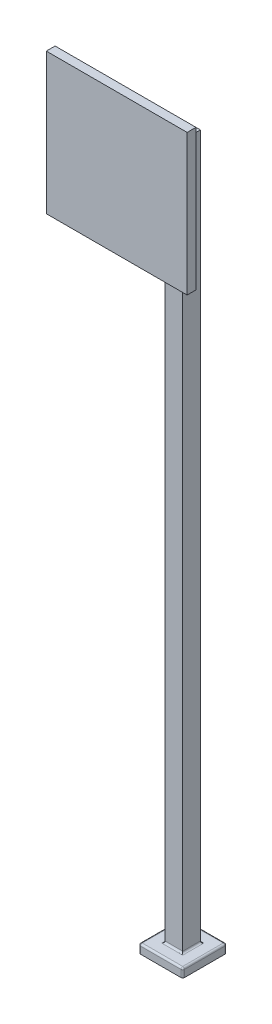
ISO-10303-21;
HEADER;
FILE_DESCRIPTION(('STEP AP214'),'2;1');
FILE_NAME('part.step','',(''),(''),'','','');
FILE_SCHEMA(('AUTOMOTIVE_DESIGN { 1 0 10303 214 1 1 1 1 }'));
ENDSEC;
DATA;
#1=APPLICATION_CONTEXT('core data for automotive mechanical design processes');
#2=APPLICATION_PROTOCOL_DEFINITION('international standard','automotive_design',2000,#1);
#3=PRODUCT_CONTEXT('',#1,'mechanical');
#4=PRODUCT('Part','Part','',(#3));
#5=PRODUCT_RELATED_PRODUCT_CATEGORY('part','',(#4));
#6=PRODUCT_DEFINITION_FORMATION('','',#4);
#7=PRODUCT_DEFINITION_CONTEXT('part definition',#1,'design');
#8=PRODUCT_DEFINITION('design','',#6,#7);
#9=PRODUCT_DEFINITION_SHAPE('','',#8);
#10=(LENGTH_UNIT() NAMED_UNIT(*) SI_UNIT(.MILLI.,.METRE.));
#11=(NAMED_UNIT(*) PLANE_ANGLE_UNIT() SI_UNIT($,.RADIAN.));
#12=(NAMED_UNIT(*) SI_UNIT($,.STERADIAN.) SOLID_ANGLE_UNIT());
#13=UNCERTAINTY_MEASURE_WITH_UNIT(LENGTH_MEASURE(1.E-05),#10,'distance_accuracy_value','');
#14=(GEOMETRIC_REPRESENTATION_CONTEXT(3) GLOBAL_UNCERTAINTY_ASSIGNED_CONTEXT((#13)) GLOBAL_UNIT_ASSIGNED_CONTEXT((#10,
#11,#12)) REPRESENTATION_CONTEXT('',''));
#15=CARTESIAN_POINT('',(0.,0.,0.));
#16=DIRECTION('',(0.,0.,1.));
#17=DIRECTION('',(1.,0.,0.));
#18=AXIS2_PLACEMENT_3D('',#15,#16,#17);
#19=CARTESIAN_POINT('',(-50.0000000000005,4000.,50.));
#20=DIRECTION('',(0.,-1.,0.));
#21=DIRECTION('',(0.,0.,-1.));
#22=AXIS2_PLACEMENT_3D('',#19,#20,#21);
#23=PLANE('',#22);
#24=DIRECTION('',(0.,0.,1.));
#25=VECTOR('',#24,1.);
#26=CARTESIAN_POINT('',(-25.,4000.,-50.));
#27=LINE('',#26,#25);
#28=CARTESIAN_POINT('',(-25.,4000.,60.));
#29=VERTEX_POINT('',#28);
#30=CARTESIAN_POINT('',(-25.,4000.,315.));
#31=VERTEX_POINT('',#30);
#32=EDGE_CURVE('E273',#29,#31,#27,.T.);
#33=ORIENTED_EDGE('',*,*,#32,.T.);
#34=DIRECTION('',(-1.,0.,0.));
#35=VECTOR('',#34,1.);
#36=CARTESIAN_POINT('',(35.,4000.,315.));
#37=LINE('',#36,#35);
#38=CARTESIAN_POINT('',(25.,4000.,315.));
#39=VERTEX_POINT('',#38);
#40=EDGE_CURVE('E529',#31,#39,#37,.F.);
#41=ORIENTED_EDGE('',*,*,#40,.T.);
#42=DIRECTION('',(0.,0.,1.));
#43=VECTOR('',#42,1.);
#44=CARTESIAN_POINT('',(25.,4000.,-50.));
#45=LINE('',#44,#43);
#46=CARTESIAN_POINT('',(25.,4000.,60.));
#47=VERTEX_POINT('',#46);
#48=EDGE_CURVE('E260',#47,#39,#45,.T.);
#49=ORIENTED_EDGE('',*,*,#48,.F.);
#50=CARTESIAN_POINT('',(35.,4000.,60.));
#51=DIRECTION('',(0.,-1.,0.));
#52=DIRECTION('',(0.,0.,-1.));
#53=AXIS2_PLACEMENT_3D('',#50,#51,#52);
#54=CIRCLE('',#53,10.);
#55=CARTESIAN_POINT('',(35.,4000.,50.));
#56=VERTEX_POINT('',#55);
#57=EDGE_CURVE('E516',#47,#56,#54,.T.);
#58=ORIENTED_EDGE('',*,*,#57,.T.);
#59=DIRECTION('',(-1.,0.,0.));
#60=VECTOR('',#59,1.);
#61=CARTESIAN_POINT('',(-50.0000000000005,4000.,50.));
#62=LINE('',#61,#60);
#63=CARTESIAN_POINT('',(49.999999999999,4000.,50.));
#64=VERTEX_POINT('',#63);
#65=EDGE_CURVE('E313',#64,#56,#62,.T.);
#66=ORIENTED_EDGE('',*,*,#65,.F.);
#67=DIRECTION('',(0.,0.,-1.));
#68=VECTOR('',#67,1.);
#69=CARTESIAN_POINT('',(49.999999999999,4000.,50.));
#70=LINE('',#69,#68);
#71=CARTESIAN_POINT('',(49.999999999999,4000.,-50.));
#72=VERTEX_POINT('',#71);
#73=EDGE_CURVE('E329',#64,#72,#70,.T.);
#74=ORIENTED_EDGE('',*,*,#73,.T.);
#75=DIRECTION('',(-1.,0.,0.));
#76=VECTOR('',#75,1.);
#77=CARTESIAN_POINT('',(-50.0000000000005,4000.,-50.));
#78=LINE('',#77,#76);
#79=CARTESIAN_POINT('',(-50.0000000000005,4000.,-50.));
#80=VERTEX_POINT('',#79);
#81=EDGE_CURVE('E309',#72,#80,#78,.T.);
#82=ORIENTED_EDGE('',*,*,#81,.T.);
#83=DIRECTION('',(0.,0.,-1.));
#84=VECTOR('',#83,1.);
#85=CARTESIAN_POINT('',(-50.0000000000005,4000.,50.));
#86=LINE('',#85,#84);
#87=CARTESIAN_POINT('',(-50.0000000000005,4000.,50.));
#88=VERTEX_POINT('',#87);
#89=EDGE_CURVE('E317',#88,#80,#86,.T.);
#90=ORIENTED_EDGE('',*,*,#89,.F.);
#91=CARTESIAN_POINT('',(-35.,4000.,50.));
#92=VERTEX_POINT('',#91);
#93=EDGE_CURVE('E312',#92,#88,#62,.T.);
#94=ORIENTED_EDGE('',*,*,#93,.F.);
#95=CARTESIAN_POINT('',(-35.,4000.,60.));
#96=DIRECTION('',(0.,-1.,0.));
#97=DIRECTION('',(0.,0.,-1.));
#98=AXIS2_PLACEMENT_3D('',#95,#96,#97);
#99=CIRCLE('',#98,10.);
#100=EDGE_CURVE('E510',#92,#29,#99,.T.);
#101=ORIENTED_EDGE('',*,*,#100,.T.);
#102=EDGE_LOOP('',(#33,#41,#49,#58,#66,#74,#82,#90,#94,#101));
#103=FACE_BOUND('',#102,.T.);
#104=ADVANCED_FACE('F47',(#103),#23,.F.);
#105=CARTESIAN_POINT('',(-25.,3950.,-50.));
#106=DIRECTION('',(0.,-1.,0.));
#107=DIRECTION('',(0.,0.,-1.));
#108=AXIS2_PLACEMENT_3D('',#105,#106,#107);
#109=PLANE('',#108);
#110=DIRECTION('',(0.,0.,-1.));
#111=VECTOR('',#110,1.);
#112=CARTESIAN_POINT('',(25.,3950.,-50.));
#113=LINE('',#112,#111);
#114=CARTESIAN_POINT('',(25.,3950.,315.));
#115=VERTEX_POINT('',#114);
#116=CARTESIAN_POINT('',(25.,3950.,60.));
#117=VERTEX_POINT('',#116);
#118=EDGE_CURVE('E266',#115,#117,#113,.T.);
#119=ORIENTED_EDGE('',*,*,#118,.F.);
#120=DIRECTION('',(-1.,0.,0.));
#121=VECTOR('',#120,1.);
#122=CARTESIAN_POINT('',(-25.,3950.,315.));
#123=LINE('',#122,#121);
#124=CARTESIAN_POINT('',(-25.,3950.,315.));
#125=VERTEX_POINT('',#124);
#126=EDGE_CURVE('E519',#115,#125,#123,.T.);
#127=ORIENTED_EDGE('',*,*,#126,.T.);
#128=DIRECTION('',(0.,0.,-1.));
#129=VECTOR('',#128,1.);
#130=CARTESIAN_POINT('',(-25.,3950.,-50.));
#131=LINE('',#130,#129);
#132=CARTESIAN_POINT('',(-25.,3950.,60.));
#133=VERTEX_POINT('',#132);
#134=EDGE_CURVE('E277',#125,#133,#131,.T.);
#135=ORIENTED_EDGE('',*,*,#134,.T.);
#136=CARTESIAN_POINT('',(-35.,3950.,60.));
#137=DIRECTION('',(0.,-1.,0.));
#138=DIRECTION('',(0.,0.,-1.));
#139=AXIS2_PLACEMENT_3D('',#136,#137,#138);
#140=CIRCLE('',#139,10.);
#141=CARTESIAN_POINT('',(-35.,3950.,50.));
#142=VERTEX_POINT('',#141);
#143=EDGE_CURVE('E506',#133,#142,#140,.F.);
#144=ORIENTED_EDGE('',*,*,#143,.T.);
#145=DIRECTION('',(1.,0.,0.));
#146=VECTOR('',#145,1.);
#147=CARTESIAN_POINT('',(0.,3950.,50.));
#148=LINE('',#147,#146);
#149=CARTESIAN_POINT('',(35.,3950.,50.));
#150=VERTEX_POINT('',#149);
#151=EDGE_CURVE('E280',#142,#150,#148,.T.);
#152=ORIENTED_EDGE('',*,*,#151,.T.);
#153=CARTESIAN_POINT('',(35.,3950.,60.));
#154=DIRECTION('',(0.,-1.,0.));
#155=DIRECTION('',(0.,0.,-1.));
#156=AXIS2_PLACEMENT_3D('',#153,#154,#155);
#157=CIRCLE('',#156,10.);
#158=EDGE_CURVE('E513',#150,#117,#157,.F.);
#159=ORIENTED_EDGE('',*,*,#158,.T.);
#160=EDGE_LOOP('',(#119,#127,#135,#144,#152,#159));
#161=FACE_BOUND('',#160,.T.);
#162=ADVANCED_FACE('F564',(#161),#109,.T.);
#163=CARTESIAN_POINT('',(-25.,0.,0.));
#164=DIRECTION('',(-1.,0.,0.));
#165=DIRECTION('',(0.,0.,1.));
#166=AXIS2_PLACEMENT_3D('',#163,#164,#165);
#167=PLANE('',#166);
#168=ORIENTED_EDGE('',*,*,#32,.F.);
#169=DIRECTION('',(0.,-1.,0.));
#170=VECTOR('',#169,1.);
#171=CARTESIAN_POINT('',(-25.,3950.,60.));
#172=LINE('',#171,#170);
#173=EDGE_CURVE('E484',#29,#133,#172,.T.);
#174=ORIENTED_EDGE('',*,*,#173,.T.);
#175=ORIENTED_EDGE('',*,*,#134,.F.);
#176=DIRECTION('',(0.,1.,0.));
#177=VECTOR('',#176,1.);
#178=CARTESIAN_POINT('',(-25.,0.,315.));
#179=LINE('',#178,#177);
#180=EDGE_CURVE('E420',#125,#31,#179,.T.);
#181=ORIENTED_EDGE('',*,*,#180,.T.);
#182=EDGE_LOOP('',(#168,#174,#175,#181));
#183=FACE_BOUND('',#182,.T.);
#184=ADVANCED_FACE('F548',(#183),#167,.T.);
#185=CARTESIAN_POINT('',(25.,0.,0.));
#186=DIRECTION('',(-1.,0.,0.));
#187=DIRECTION('',(0.,0.,1.));
#188=AXIS2_PLACEMENT_3D('',#185,#186,#187);
#189=PLANE('',#188);
#190=ORIENTED_EDGE('',*,*,#48,.T.);
#191=DIRECTION('',(0.,1.,0.));
#192=VECTOR('',#191,1.);
#193=CARTESIAN_POINT('',(25.,3950.,315.));
#194=LINE('',#193,#192);
#195=EDGE_CURVE('E502',#39,#115,#194,.F.);
#196=ORIENTED_EDGE('',*,*,#195,.T.);
#197=ORIENTED_EDGE('',*,*,#118,.T.);
#198=DIRECTION('',(0.,-1.,0.));
#199=VECTOR('',#198,1.);
#200=CARTESIAN_POINT('',(25.,0.,60.));
#201=LINE('',#200,#199);
#202=EDGE_CURVE('E499',#117,#47,#201,.F.);
#203=ORIENTED_EDGE('',*,*,#202,.T.);
#204=EDGE_LOOP('',(#190,#196,#197,#203));
#205=FACE_BOUND('',#204,.T.);
#206=ADVANCED_FACE('F560',(#205),#189,.F.);
#207=CARTESIAN_POINT('',(-50.0000000000005,4000.,50.));
#208=DIRECTION('',(1.,0.,0.));
#209=DIRECTION('',(0.,1.,0.));
#210=AXIS2_PLACEMENT_3D('',#207,#208,#209);
#211=PLANE('',#210);
#212=DIRECTION('',(0.,-1.,0.));
#213=VECTOR('',#212,1.);
#214=CARTESIAN_POINT('',(-50.0000000000005,4000.,-50.));
#215=LINE('',#214,#213);
#216=CARTESIAN_POINT('',(-50.,9.99999999999979,-50.));
#217=VERTEX_POINT('',#216);
#218=EDGE_CURVE('E303',#80,#217,#215,.T.);
#219=ORIENTED_EDGE('',*,*,#218,.T.);
#220=DIRECTION('',(0.,0.,-1.));
#221=VECTOR('',#220,1.);
#222=CARTESIAN_POINT('',(-50.,9.99999999999979,50.));
#223=LINE('',#222,#221);
#224=CARTESIAN_POINT('',(-50.,9.99999999999979,50.));
#225=VERTEX_POINT('',#224);
#226=EDGE_CURVE('E414',#217,#225,#223,.F.);
#227=ORIENTED_EDGE('',*,*,#226,.T.);
#228=DIRECTION('',(0.,-1.,0.));
#229=VECTOR('',#228,1.);
#230=CARTESIAN_POINT('',(-50.0000000000005,4000.,50.));
#231=LINE('',#230,#229);
#232=EDGE_CURVE('E304',#88,#225,#231,.T.);
#233=ORIENTED_EDGE('',*,*,#232,.F.);
#234=ORIENTED_EDGE('',*,*,#89,.T.);
#235=EDGE_LOOP('',(#219,#227,#233,#234));
#236=FACE_BOUND('',#235,.T.);
#237=ADVANCED_FACE('F622',(#236),#211,.F.);
#238=CARTESIAN_POINT('',(49.999999999999,4000.,50.));
#239=DIRECTION('',(-1.,0.,0.));
#240=DIRECTION('',(0.,-1.,0.));
#241=AXIS2_PLACEMENT_3D('',#238,#239,#240);
#242=PLANE('',#241);
#243=DIRECTION('',(0.,1.,0.));
#244=VECTOR('',#243,1.);
#245=CARTESIAN_POINT('',(49.999999999999,4000.,50.));
#246=LINE('',#245,#244);
#247=CARTESIAN_POINT('',(50.,9.99999999999979,50.));
#248=VERTEX_POINT('',#247);
#249=EDGE_CURVE('E308',#248,#64,#246,.T.);
#250=ORIENTED_EDGE('',*,*,#249,.F.);
#251=DIRECTION('',(0.,0.,-1.));
#252=VECTOR('',#251,1.);
#253=CARTESIAN_POINT('',(50.,9.99999999999979,50.));
#254=LINE('',#253,#252);
#255=CARTESIAN_POINT('',(50.,9.99999999999979,-50.));
#256=VERTEX_POINT('',#255);
#257=EDGE_CURVE('E417',#248,#256,#254,.T.);
#258=ORIENTED_EDGE('',*,*,#257,.T.);
#259=DIRECTION('',(0.,1.,0.));
#260=VECTOR('',#259,1.);
#261=CARTESIAN_POINT('',(49.999999999999,4000.,-50.));
#262=LINE('',#261,#260);
#263=EDGE_CURVE('E321',#256,#72,#262,.T.);
#264=ORIENTED_EDGE('',*,*,#263,.T.);
#265=ORIENTED_EDGE('',*,*,#73,.F.);
#266=EDGE_LOOP('',(#250,#258,#264,#265));
#267=FACE_BOUND('',#266,.T.);
#268=ADVANCED_FACE('F618',(#267),#242,.F.);
#269=CARTESIAN_POINT('',(0.,0.,50.));
#270=DIRECTION('',(0.,0.,1.));
#271=DIRECTION('',(1.,0.,0.));
#272=AXIS2_PLACEMENT_3D('',#269,#270,#271);
#273=PLANE('',#272);
#274=ORIENTED_EDGE('',*,*,#151,.F.);
#275=DIRECTION('',(0.,-1.,0.));
#276=VECTOR('',#275,1.);
#277=CARTESIAN_POINT('',(-35.,4000.,50.));
#278=LINE('',#277,#276);
#279=EDGE_CURVE('E492',#142,#92,#278,.F.);
#280=ORIENTED_EDGE('',*,*,#279,.T.);
#281=ORIENTED_EDGE('',*,*,#93,.T.);
#282=ORIENTED_EDGE('',*,*,#232,.T.);
#283=DIRECTION('',(1.,0.,0.));
#284=VECTOR('',#283,1.);
#285=CARTESIAN_POINT('',(50.,10.,50.));
#286=LINE('',#285,#284);
#287=EDGE_CURVE('E381',#225,#248,#286,.T.);
#288=ORIENTED_EDGE('',*,*,#287,.T.);
#289=ORIENTED_EDGE('',*,*,#249,.T.);
#290=ORIENTED_EDGE('',*,*,#65,.T.);
#291=DIRECTION('',(0.,-1.,0.));
#292=VECTOR('',#291,1.);
#293=CARTESIAN_POINT('',(35.,0.,50.));
#294=LINE('',#293,#292);
#295=EDGE_CURVE('E488',#56,#150,#294,.T.);
#296=ORIENTED_EDGE('',*,*,#295,.T.);
#297=EDGE_LOOP('',(#274,#280,#281,#282,#288,#289,#290,#296));
#298=FACE_BOUND('',#297,.T.);
#299=ADVANCED_FACE('F621',(#298),#273,.T.);
#300=CARTESIAN_POINT('',(0.,0.,-50.));
#301=DIRECTION('',(0.,0.,1.));
#302=DIRECTION('',(1.,0.,0.));
#303=AXIS2_PLACEMENT_3D('',#300,#301,#302);
#304=PLANE('',#303);
#305=ORIENTED_EDGE('',*,*,#263,.F.);
#306=DIRECTION('',(1.,0.,0.));
#307=VECTOR('',#306,1.);
#308=CARTESIAN_POINT('',(0.,10.,-50.));
#309=LINE('',#308,#307);
#310=EDGE_CURVE('E411',#256,#217,#309,.F.);
#311=ORIENTED_EDGE('',*,*,#310,.T.);
#312=ORIENTED_EDGE('',*,*,#218,.F.);
#313=ORIENTED_EDGE('',*,*,#81,.F.);
#314=EDGE_LOOP('',(#305,#311,#312,#313));
#315=FACE_BOUND('',#314,.T.);
#316=ADVANCED_FACE('F616',(#315),#304,.F.);
#317=CARTESIAN_POINT('',(125.,-50.,-125.));
#318=DIRECTION('',(1.,0.,0.));
#319=DIRECTION('',(0.,0.,-1.));
#320=AXIS2_PLACEMENT_3D('',#317,#318,#319);
#321=PLANE('',#320);
#322=DIRECTION('',(0.,0.,-1.));
#323=VECTOR('',#322,1.);
#324=CARTESIAN_POINT('',(125.,-10.,-125.));
#325=LINE('',#324,#323);
#326=CARTESIAN_POINT('',(125.,-10.,-115.));
#327=VERTEX_POINT('',#326);
#328=CARTESIAN_POINT('',(125.,-10.,115.));
#329=VERTEX_POINT('',#328);
#330=EDGE_CURVE('E342',#327,#329,#325,.F.);
#331=ORIENTED_EDGE('',*,*,#330,.T.);
#332=DIRECTION('',(0.,1.,0.));
#333=VECTOR('',#332,1.);
#334=CARTESIAN_POINT('',(125.,-50.,115.));
#335=LINE('',#334,#333);
#336=CARTESIAN_POINT('',(125.,-50.,115.));
#337=VERTEX_POINT('',#336);
#338=EDGE_CURVE('E348',#329,#337,#335,.F.);
#339=ORIENTED_EDGE('',*,*,#338,.T.);
#340=DIRECTION('',(0.,0.,-1.));
#341=VECTOR('',#340,1.);
#342=CARTESIAN_POINT('',(125.,-50.,-125.));
#343=LINE('',#342,#341);
#344=CARTESIAN_POINT('',(125.,-50.,-115.));
#345=VERTEX_POINT('',#344);
#346=EDGE_CURVE('E287',#337,#345,#343,.T.);
#347=ORIENTED_EDGE('',*,*,#346,.T.);
#348=DIRECTION('',(0.,1.,0.));
#349=VECTOR('',#348,1.);
#350=CARTESIAN_POINT('',(125.,-50.,-115.));
#351=LINE('',#350,#349);
#352=EDGE_CURVE('E345',#345,#327,#351,.T.);
#353=ORIENTED_EDGE('',*,*,#352,.T.);
#354=EDGE_LOOP('',(#331,#339,#347,#353));
#355=FACE_BOUND('',#354,.T.);
#356=ADVANCED_FACE('F941',(#355),#321,.T.);
#357=CARTESIAN_POINT('',(-125.,-50.,125.));
#358=DIRECTION('',(0.,0.,1.));
#359=DIRECTION('',(1.,0.,0.));
#360=AXIS2_PLACEMENT_3D('',#357,#358,#359);
#361=PLANE('',#360);
#362=DIRECTION('',(1.,0.,0.));
#363=VECTOR('',#362,1.);
#364=CARTESIAN_POINT('',(-125.,-50.,125.));
#365=LINE('',#364,#363);
#366=CARTESIAN_POINT('',(-115.,-50.,125.));
#367=VERTEX_POINT('',#366);
#368=CARTESIAN_POINT('',(115.,-50.,125.));
#369=VERTEX_POINT('',#368);
#370=EDGE_CURVE('E299',#367,#369,#365,.T.);
#371=ORIENTED_EDGE('',*,*,#370,.T.);
#372=DIRECTION('',(0.,1.,0.));
#373=VECTOR('',#372,1.);
#374=CARTESIAN_POINT('',(115.,-50.,125.));
#375=LINE('',#374,#373);
#376=CARTESIAN_POINT('',(115.,-10.,125.));
#377=VERTEX_POINT('',#376);
#378=EDGE_CURVE('E339',#369,#377,#375,.T.);
#379=ORIENTED_EDGE('',*,*,#378,.T.);
#380=DIRECTION('',(1.,0.,0.));
#381=VECTOR('',#380,1.);
#382=CARTESIAN_POINT('',(-125.,-10.,125.));
#383=LINE('',#382,#381);
#384=CARTESIAN_POINT('',(-115.,-10.,125.));
#385=VERTEX_POINT('',#384);
#386=EDGE_CURVE('E333',#377,#385,#383,.F.);
#387=ORIENTED_EDGE('',*,*,#386,.T.);
#388=DIRECTION('',(0.,1.,0.));
#389=VECTOR('',#388,1.);
#390=CARTESIAN_POINT('',(-115.,-50.,125.));
#391=LINE('',#390,#389);
#392=EDGE_CURVE('E336',#385,#367,#391,.F.);
#393=ORIENTED_EDGE('',*,*,#392,.T.);
#394=EDGE_LOOP('',(#371,#379,#387,#393));
#395=FACE_BOUND('',#394,.T.);
#396=ADVANCED_FACE('F929',(#395),#361,.T.);
#397=CARTESIAN_POINT('',(-125.,-50.,-125.));
#398=DIRECTION('',(-1.,0.,0.));
#399=DIRECTION('',(0.,0.,1.));
#400=AXIS2_PLACEMENT_3D('',#397,#398,#399);
#401=PLANE('',#400);
#402=DIRECTION('',(0.,0.,1.));
#403=VECTOR('',#402,1.);
#404=CARTESIAN_POINT('',(-125.,-50.,-125.));
#405=LINE('',#404,#403);
#406=CARTESIAN_POINT('',(-125.,-50.,-115.));
#407=VERTEX_POINT('',#406);
#408=CARTESIAN_POINT('',(-125.,-50.,115.));
#409=VERTEX_POINT('',#408);
#410=EDGE_CURVE('E295',#407,#409,#405,.T.);
#411=ORIENTED_EDGE('',*,*,#410,.T.);
#412=DIRECTION('',(0.,1.,0.));
#413=VECTOR('',#412,1.);
#414=CARTESIAN_POINT('',(-125.,-50.,115.));
#415=LINE('',#414,#413);
#416=CARTESIAN_POINT('',(-125.,-10.,115.));
#417=VERTEX_POINT('',#416);
#418=EDGE_CURVE('E369',#409,#417,#415,.T.);
#419=ORIENTED_EDGE('',*,*,#418,.T.);
#420=DIRECTION('',(0.,0.,1.));
#421=VECTOR('',#420,1.);
#422=CARTESIAN_POINT('',(-125.,-10.,-125.));
#423=LINE('',#422,#421);
#424=CARTESIAN_POINT('',(-125.,-10.,-115.));
#425=VERTEX_POINT('',#424);
#426=EDGE_CURVE('E363',#417,#425,#423,.F.);
#427=ORIENTED_EDGE('',*,*,#426,.T.);
#428=DIRECTION('',(0.,1.,0.));
#429=VECTOR('',#428,1.);
#430=CARTESIAN_POINT('',(-125.,-50.,-115.));
#431=LINE('',#430,#429);
#432=EDGE_CURVE('E366',#425,#407,#431,.F.);
#433=ORIENTED_EDGE('',*,*,#432,.T.);
#434=EDGE_LOOP('',(#411,#419,#427,#433));
#435=FACE_BOUND('',#434,.T.);
#436=ADVANCED_FACE('F917',(#435),#401,.T.);
#437=CARTESIAN_POINT('',(-125.,-50.,-125.));
#438=DIRECTION('',(0.,0.,-1.));
#439=DIRECTION('',(-1.,0.,0.));
#440=AXIS2_PLACEMENT_3D('',#437,#438,#439);
#441=PLANE('',#440);
#442=DIRECTION('',(-1.,0.,0.));
#443=VECTOR('',#442,1.);
#444=CARTESIAN_POINT('',(-125.,-50.,-125.));
#445=LINE('',#444,#443);
#446=CARTESIAN_POINT('',(115.,-50.,-125.));
#447=VERTEX_POINT('',#446);
#448=CARTESIAN_POINT('',(-115.,-50.,-125.));
#449=VERTEX_POINT('',#448);
#450=EDGE_CURVE('E291',#447,#449,#445,.T.);
#451=ORIENTED_EDGE('',*,*,#450,.T.);
#452=DIRECTION('',(0.,1.,0.));
#453=VECTOR('',#452,1.);
#454=CARTESIAN_POINT('',(-115.,-50.,-125.));
#455=LINE('',#454,#453);
#456=CARTESIAN_POINT('',(-115.,-10.,-125.));
#457=VERTEX_POINT('',#456);
#458=EDGE_CURVE('E378',#449,#457,#455,.T.);
#459=ORIENTED_EDGE('',*,*,#458,.T.);
#460=DIRECTION('',(-1.,0.,0.));
#461=VECTOR('',#460,1.);
#462=CARTESIAN_POINT('',(-125.,-10.,-125.));
#463=LINE('',#462,#461);
#464=CARTESIAN_POINT('',(115.,-10.,-125.));
#465=VERTEX_POINT('',#464);
#466=EDGE_CURVE('E372',#457,#465,#463,.F.);
#467=ORIENTED_EDGE('',*,*,#466,.T.);
#468=DIRECTION('',(0.,1.,0.));
#469=VECTOR('',#468,1.);
#470=CARTESIAN_POINT('',(115.,-50.,-125.));
#471=LINE('',#470,#469);
#472=EDGE_CURVE('E375',#465,#447,#471,.F.);
#473=ORIENTED_EDGE('',*,*,#472,.T.);
#474=EDGE_LOOP('',(#451,#459,#467,#473));
#475=FACE_BOUND('',#474,.T.);
#476=ADVANCED_FACE('F905',(#475),#441,.T.);
#477=CARTESIAN_POINT('',(0.,-50.,0.));
#478=DIRECTION('',(0.,1.,0.));
#479=DIRECTION('',(0.,0.,1.));
#480=AXIS2_PLACEMENT_3D('',#477,#478,#479);
#481=PLANE('',#480);
#482=ORIENTED_EDGE('',*,*,#346,.F.);
#483=CARTESIAN_POINT('',(115.,-50.,115.));
#484=DIRECTION('',(0.,1.,0.));
#485=DIRECTION('',(0.,0.,1.));
#486=AXIS2_PLACEMENT_3D('',#483,#484,#485);
#487=CIRCLE('',#486,10.);
#488=EDGE_CURVE('E360',#337,#369,#487,.F.);
#489=ORIENTED_EDGE('',*,*,#488,.T.);
#490=ORIENTED_EDGE('',*,*,#370,.F.);
#491=CARTESIAN_POINT('',(-115.,-50.,115.));
#492=DIRECTION('',(0.,1.,0.));
#493=DIRECTION('',(0.,0.,1.));
#494=AXIS2_PLACEMENT_3D('',#491,#492,#493);
#495=CIRCLE('',#494,10.);
#496=EDGE_CURVE('E357',#367,#409,#495,.F.);
#497=ORIENTED_EDGE('',*,*,#496,.T.);
#498=ORIENTED_EDGE('',*,*,#410,.F.);
#499=CARTESIAN_POINT('',(-115.,-50.,-115.));
#500=DIRECTION('',(0.,1.,0.));
#501=DIRECTION('',(0.,0.,1.));
#502=AXIS2_PLACEMENT_3D('',#499,#500,#501);
#503=CIRCLE('',#502,10.);
#504=EDGE_CURVE('E354',#407,#449,#503,.F.);
#505=ORIENTED_EDGE('',*,*,#504,.T.);
#506=ORIENTED_EDGE('',*,*,#450,.F.);
#507=CARTESIAN_POINT('',(115.,-50.,-115.));
#508=DIRECTION('',(0.,1.,0.));
#509=DIRECTION('',(0.,0.,1.));
#510=AXIS2_PLACEMENT_3D('',#507,#508,#509);
#511=CIRCLE('',#510,10.);
#512=EDGE_CURVE('E351',#447,#345,#511,.F.);
#513=ORIENTED_EDGE('',*,*,#512,.T.);
#514=EDGE_LOOP('',(#482,#489,#490,#497,#498,#505,#506,#513));
#515=FACE_BOUND('',#514,.T.);
#516=ADVANCED_FACE('F893',(#515),#481,.F.);
#517=CARTESIAN_POINT('',(0.,0.,0.));
#518=DIRECTION('',(0.,1.,0.));
#519=DIRECTION('',(0.,0.,1.));
#520=AXIS2_PLACEMENT_3D('',#517,#518,#519);
#521=PLANE('',#520);
#522=DIRECTION('',(1.,0.,0.));
#523=VECTOR('',#522,1.);
#524=CARTESIAN_POINT('',(-50.,0.,60.));
#525=LINE('',#524,#523);
#526=CARTESIAN_POINT('',(60.,0.,60.));
#527=VERTEX_POINT('',#526);
#528=CARTESIAN_POINT('',(-60.,0.,60.));
#529=VERTEX_POINT('',#528);
#530=EDGE_CURVE('E404',#527,#529,#525,.F.);
#531=ORIENTED_EDGE('',*,*,#530,.T.);
#532=DIRECTION('',(0.,0.,-1.));
#533=VECTOR('',#532,1.);
#534=CARTESIAN_POINT('',(-60.,0.,0.));
#535=LINE('',#534,#533);
#536=CARTESIAN_POINT('',(-60.,0.,-60.));
#537=VERTEX_POINT('',#536);
#538=EDGE_CURVE('E408',#529,#537,#535,.T.);
#539=ORIENTED_EDGE('',*,*,#538,.T.);
#540=DIRECTION('',(1.,0.,0.));
#541=VECTOR('',#540,1.);
#542=CARTESIAN_POINT('',(0.,0.,-60.));
#543=LINE('',#542,#541);
#544=CARTESIAN_POINT('',(60.,0.,-60.));
#545=VERTEX_POINT('',#544);
#546=EDGE_CURVE('E401',#537,#545,#543,.T.);
#547=ORIENTED_EDGE('',*,*,#546,.T.);
#548=DIRECTION('',(0.,0.,-1.));
#549=VECTOR('',#548,1.);
#550=CARTESIAN_POINT('',(60.,0.,0.));
#551=LINE('',#550,#549);
#552=EDGE_CURVE('E398',#545,#527,#551,.F.);
#553=ORIENTED_EDGE('',*,*,#552,.T.);
#554=EDGE_LOOP('',(#531,#539,#547,#553));
#555=FACE_BOUND('',#554,.T.);
#556=DIRECTION('',(0.,0.,1.));
#557=VECTOR('',#556,1.);
#558=CARTESIAN_POINT('',(-115.,0.,0.));
#559=LINE('',#558,#557);
#560=CARTESIAN_POINT('',(-115.,0.,-115.));
#561=VERTEX_POINT('',#560);
#562=CARTESIAN_POINT('',(-115.,0.,115.));
#563=VERTEX_POINT('',#562);
#564=EDGE_CURVE('E391',#561,#563,#559,.T.);
#565=ORIENTED_EDGE('',*,*,#564,.T.);
#566=DIRECTION('',(1.,0.,0.));
#567=VECTOR('',#566,1.);
#568=CARTESIAN_POINT('',(0.,0.,115.));
#569=LINE('',#568,#567);
#570=CARTESIAN_POINT('',(115.,0.,115.));
#571=VERTEX_POINT('',#570);
#572=EDGE_CURVE('E394',#563,#571,#569,.T.);
#573=ORIENTED_EDGE('',*,*,#572,.T.);
#574=DIRECTION('',(0.,0.,-1.));
#575=VECTOR('',#574,1.);
#576=CARTESIAN_POINT('',(115.,0.,0.));
#577=LINE('',#576,#575);
#578=CARTESIAN_POINT('',(115.,0.,-115.));
#579=VERTEX_POINT('',#578);
#580=EDGE_CURVE('E385',#571,#579,#577,.T.);
#581=ORIENTED_EDGE('',*,*,#580,.T.);
#582=DIRECTION('',(-1.,0.,0.));
#583=VECTOR('',#582,1.);
#584=CARTESIAN_POINT('',(0.,0.,-115.));
#585=LINE('',#584,#583);
#586=EDGE_CURVE('E388',#579,#561,#585,.T.);
#587=ORIENTED_EDGE('',*,*,#586,.T.);
#588=EDGE_LOOP('',(#565,#573,#581,#587));
#589=FACE_BOUND('',#588,.T.);
#590=ADVANCED_FACE('F887',(#555,#589),#521,.T.);
#591=CARTESIAN_POINT('',(400.,4375.,375.));
#592=DIRECTION('',(-1.,0.,0.));
#593=DIRECTION('',(0.,-1.,0.));
#594=AXIS2_PLACEMENT_3D('',#591,#592,#593);
#595=PLANE('',#594);
#596=DIRECTION('',(0.,1.,0.));
#597=VECTOR('',#596,1.);
#598=CARTESIAN_POINT('',(400.,4375.,325.));
#599=LINE('',#598,#597);
#600=CARTESIAN_POINT('',(400.,3575.,325.));
#601=VERTEX_POINT('',#600);
#602=CARTESIAN_POINT('',(400.,4375.,325.));
#603=VERTEX_POINT('',#602);
#604=EDGE_CURVE('E258',#601,#603,#599,.T.);
#605=ORIENTED_EDGE('',*,*,#604,.T.);
#606=DIRECTION('',(0.,0.,-1.));
#607=VECTOR('',#606,1.);
#608=CARTESIAN_POINT('',(400.,4375.,375.));
#609=LINE('',#608,#607);
#610=CARTESIAN_POINT('',(400.,4375.,375.));
#611=VERTEX_POINT('',#610);
#612=EDGE_CURVE('E236',#611,#603,#609,.T.);
#613=ORIENTED_EDGE('',*,*,#612,.F.);
#614=DIRECTION('',(0.,1.,0.));
#615=VECTOR('',#614,1.);
#616=CARTESIAN_POINT('',(400.,4375.,375.));
#617=LINE('',#616,#615);
#618=CARTESIAN_POINT('',(400.,3575.,375.));
#619=VERTEX_POINT('',#618);
#620=EDGE_CURVE('E244',#619,#611,#617,.T.);
#621=ORIENTED_EDGE('',*,*,#620,.F.);
#622=DIRECTION('',(0.,0.,-1.));
#623=VECTOR('',#622,1.);
#624=CARTESIAN_POINT('',(400.,3575.,375.));
#625=LINE('',#624,#623);
#626=EDGE_CURVE('E589',#619,#601,#625,.T.);
#627=ORIENTED_EDGE('',*,*,#626,.T.);
#628=EDGE_LOOP('',(#605,#613,#621,#627));
#629=FACE_BOUND('',#628,.T.);
#630=ADVANCED_FACE('F256',(#629),#595,.F.);
#631=CARTESIAN_POINT('',(-400.,4375.,375.));
#632=DIRECTION('',(0.,-1.,0.));
#633=DIRECTION('',(0.,0.,-1.));
#634=AXIS2_PLACEMENT_3D('',#631,#632,#633);
#635=PLANE('',#634);
#636=DIRECTION('',(-1.,0.,0.));
#637=VECTOR('',#636,1.);
#638=CARTESIAN_POINT('',(-400.,4375.,325.));
#639=LINE('',#638,#637);
#640=CARTESIAN_POINT('',(-400.,4375.,325.));
#641=VERTEX_POINT('',#640);
#642=EDGE_CURVE('E576',#603,#641,#639,.T.);
#643=ORIENTED_EDGE('',*,*,#642,.T.);
#644=DIRECTION('',(0.,0.,-1.));
#645=VECTOR('',#644,1.);
#646=CARTESIAN_POINT('',(-400.,4375.,375.));
#647=LINE('',#646,#645);
#648=CARTESIAN_POINT('',(-400.,4375.,375.));
#649=VERTEX_POINT('',#648);
#650=EDGE_CURVE('E239',#649,#641,#647,.T.);
#651=ORIENTED_EDGE('',*,*,#650,.F.);
#652=DIRECTION('',(-1.,0.,0.));
#653=VECTOR('',#652,1.);
#654=CARTESIAN_POINT('',(-400.,4375.,375.));
#655=LINE('',#654,#653);
#656=EDGE_CURVE('E232',#611,#649,#655,.T.);
#657=ORIENTED_EDGE('',*,*,#656,.F.);
#658=ORIENTED_EDGE('',*,*,#612,.T.);
#659=EDGE_LOOP('',(#643,#651,#657,#658));
#660=FACE_BOUND('',#659,.T.);
#661=ADVANCED_FACE('F234',(#660),#635,.F.);
#662=CARTESIAN_POINT('',(-400.,4375.,375.));
#663=DIRECTION('',(1.,0.,0.));
#664=DIRECTION('',(0.,1.,0.));
#665=AXIS2_PLACEMENT_3D('',#662,#663,#664);
#666=PLANE('',#665);
#667=DIRECTION('',(0.,-1.,0.));
#668=VECTOR('',#667,1.);
#669=CARTESIAN_POINT('',(-400.,4375.,325.));
#670=LINE('',#669,#668);
#671=CARTESIAN_POINT('',(-400.,3575.,325.));
#672=VERTEX_POINT('',#671);
#673=EDGE_CURVE('E580',#641,#672,#670,.T.);
#674=ORIENTED_EDGE('',*,*,#673,.T.);
#675=DIRECTION('',(0.,0.,-1.));
#676=VECTOR('',#675,1.);
#677=CARTESIAN_POINT('',(-400.,3575.,375.));
#678=LINE('',#677,#676);
#679=CARTESIAN_POINT('',(-400.,3575.,375.));
#680=VERTEX_POINT('',#679);
#681=EDGE_CURVE('E269',#680,#672,#678,.T.);
#682=ORIENTED_EDGE('',*,*,#681,.F.);
#683=DIRECTION('',(0.,-1.,0.));
#684=VECTOR('',#683,1.);
#685=CARTESIAN_POINT('',(-400.,4375.,375.));
#686=LINE('',#685,#684);
#687=EDGE_CURVE('E243',#649,#680,#686,.T.);
#688=ORIENTED_EDGE('',*,*,#687,.F.);
#689=ORIENTED_EDGE('',*,*,#650,.T.);
#690=EDGE_LOOP('',(#674,#682,#688,#689));
#691=FACE_BOUND('',#690,.T.);
#692=ADVANCED_FACE('F596',(#691),#666,.F.);
#693=CARTESIAN_POINT('',(-400.,3575.,375.));
#694=DIRECTION('',(0.,1.,0.));
#695=DIRECTION('',(0.,0.,1.));
#696=AXIS2_PLACEMENT_3D('',#693,#694,#695);
#697=PLANE('',#696);
#698=DIRECTION('',(1.,0.,0.));
#699=VECTOR('',#698,1.);
#700=CARTESIAN_POINT('',(-400.,3575.,325.));
#701=LINE('',#700,#699);
#702=EDGE_CURVE('E254',#672,#601,#701,.T.);
#703=ORIENTED_EDGE('',*,*,#702,.T.);
#704=ORIENTED_EDGE('',*,*,#626,.F.);
#705=DIRECTION('',(1.,0.,0.));
#706=VECTOR('',#705,1.);
#707=CARTESIAN_POINT('',(-400.,3575.,375.));
#708=LINE('',#707,#706);
#709=EDGE_CURVE('E249',#680,#619,#708,.T.);
#710=ORIENTED_EDGE('',*,*,#709,.F.);
#711=ORIENTED_EDGE('',*,*,#681,.T.);
#712=EDGE_LOOP('',(#703,#704,#710,#711));
#713=FACE_BOUND('',#712,.T.);
#714=ADVANCED_FACE('F594',(#713),#697,.F.);
#715=CARTESIAN_POINT('',(0.,0.,375.));
#716=DIRECTION('',(0.,0.,1.));
#717=DIRECTION('',(1.,0.,0.));
#718=AXIS2_PLACEMENT_3D('',#715,#716,#717);
#719=PLANE('',#718);
#720=ORIENTED_EDGE('',*,*,#620,.T.);
#721=ORIENTED_EDGE('',*,*,#656,.T.);
#722=ORIENTED_EDGE('',*,*,#687,.T.);
#723=ORIENTED_EDGE('',*,*,#709,.T.);
#724=EDGE_LOOP('',(#720,#721,#722,#723));
#725=FACE_BOUND('',#724,.T.);
#726=ADVANCED_FACE('F247',(#725),#719,.T.);
#727=CARTESIAN_POINT('',(0.,0.,325.));
#728=DIRECTION('',(0.,0.,1.));
#729=DIRECTION('',(1.,0.,0.));
#730=AXIS2_PLACEMENT_3D('',#727,#728,#729);
#731=PLANE('',#730);
#732=DIRECTION('',(0.,1.,0.));
#733=VECTOR('',#732,1.);
#734=CARTESIAN_POINT('',(-35.,0.,325.));
#735=LINE('',#734,#733);
#736=CARTESIAN_POINT('',(-35.,4010.,325.));
#737=VERTEX_POINT('',#736);
#738=CARTESIAN_POINT('',(-35.,3940.,325.));
#739=VERTEX_POINT('',#738);
#740=EDGE_CURVE('E63',#737,#739,#735,.F.);
#741=ORIENTED_EDGE('',*,*,#740,.T.);
#742=DIRECTION('',(-1.,0.,0.));
#743=VECTOR('',#742,1.);
#744=CARTESIAN_POINT('',(0.,3940.,325.));
#745=LINE('',#744,#743);
#746=CARTESIAN_POINT('',(35.,3940.,325.));
#747=VERTEX_POINT('',#746);
#748=EDGE_CURVE('E526',#739,#747,#745,.F.);
#749=ORIENTED_EDGE('',*,*,#748,.T.);
#750=DIRECTION('',(0.,1.,0.));
#751=VECTOR('',#750,1.);
#752=CARTESIAN_POINT('',(35.,4000.,325.));
#753=LINE('',#752,#751);
#754=CARTESIAN_POINT('',(35.,4010.,325.));
#755=VERTEX_POINT('',#754);
#756=EDGE_CURVE('E70',#747,#755,#753,.T.);
#757=ORIENTED_EDGE('',*,*,#756,.T.);
#758=DIRECTION('',(-1.,0.,0.));
#759=VECTOR('',#758,1.);
#760=CARTESIAN_POINT('',(-35.,4010.,325.));
#761=LINE('',#760,#759);
#762=EDGE_CURVE('E523',#755,#737,#761,.T.);
#763=ORIENTED_EDGE('',*,*,#762,.T.);
#764=EDGE_LOOP('',(#741,#749,#757,#763));
#765=FACE_BOUND('',#764,.T.);
#766=ORIENTED_EDGE('',*,*,#604,.F.);
#767=ORIENTED_EDGE('',*,*,#702,.F.);
#768=ORIENTED_EDGE('',*,*,#673,.F.);
#769=ORIENTED_EDGE('',*,*,#642,.F.);
#770=EDGE_LOOP('',(#766,#767,#768,#769));
#771=FACE_BOUND('',#770,.T.);
#772=ADVANCED_FACE('F569',(#765,#771),#731,.F.);
#773=CARTESIAN_POINT('',(-115.,-50.,-115.));
#774=DIRECTION('',(0.,1.,0.));
#775=DIRECTION('',(0.,0.,1.));
#776=AXIS2_PLACEMENT_3D('',#773,#774,#775);
#777=CYLINDRICAL_SURFACE('',#776,10.);
#778=CARTESIAN_POINT('',(-115.,-10.,-115.));
#779=DIRECTION('',(0.,1.,0.));
#780=DIRECTION('',(0.,0.,1.));
#781=AXIS2_PLACEMENT_3D('',#778,#779,#780);
#782=CIRCLE('',#781,10.);
#783=EDGE_CURVE('E464',#457,#425,#782,.T.);
#784=ORIENTED_EDGE('',*,*,#783,.F.);
#785=ORIENTED_EDGE('',*,*,#458,.F.);
#786=ORIENTED_EDGE('',*,*,#504,.F.);
#787=ORIENTED_EDGE('',*,*,#432,.F.);
#788=EDGE_LOOP('',(#784,#785,#786,#787));
#789=FACE_BOUND('',#788,.T.);
#790=ADVANCED_FACE('F572',(#789),#777,.T.);
#791=CARTESIAN_POINT('',(-115.,-10.,-115.));
#792=DIRECTION('',(-1.,0.,0.));
#793=DIRECTION('',(0.,0.,1.));
#794=AXIS2_PLACEMENT_3D('',#791,#792,#793);
#795=SPHERICAL_SURFACE('',#794,10.);
#796=CARTESIAN_POINT('',(-115.,-10.,-115.));
#797=DIRECTION('',(-1.,0.,0.));
#798=DIRECTION('',(0.,0.,1.));
#799=AXIS2_PLACEMENT_3D('',#796,#797,#798);
#800=CIRCLE('',#799,10.);
#801=EDGE_CURVE('E456',#457,#561,#800,.F.);
#802=ORIENTED_EDGE('',*,*,#801,.F.);
#803=ORIENTED_EDGE('',*,*,#783,.T.);
#804=CARTESIAN_POINT('',(-115.,-10.,-115.));
#805=DIRECTION('',(0.,0.,-1.));
#806=DIRECTION('',(-1.,0.,0.));
#807=AXIS2_PLACEMENT_3D('',#804,#805,#806);
#808=CIRCLE('',#807,10.);
#809=EDGE_CURVE('E460',#561,#425,#808,.F.);
#810=ORIENTED_EDGE('',*,*,#809,.F.);
#811=EDGE_LOOP('',(#802,#803,#810));
#812=FACE_BOUND('',#811,.T.);
#813=ADVANCED_FACE('F666',(#812),#795,.T.);
#814=CARTESIAN_POINT('',(-115.,-50.,115.));
#815=DIRECTION('',(0.,1.,0.));
#816=DIRECTION('',(0.,0.,1.));
#817=AXIS2_PLACEMENT_3D('',#814,#815,#816);
#818=CYLINDRICAL_SURFACE('',#817,10.);
#819=ORIENTED_EDGE('',*,*,#496,.F.);
#820=ORIENTED_EDGE('',*,*,#392,.F.);
#821=CARTESIAN_POINT('',(-115.,-10.,115.));
#822=DIRECTION('',(0.,1.,0.));
#823=DIRECTION('',(0.,0.,1.));
#824=AXIS2_PLACEMENT_3D('',#821,#822,#823);
#825=CIRCLE('',#824,10.);
#826=EDGE_CURVE('E452',#417,#385,#825,.T.);
#827=ORIENTED_EDGE('',*,*,#826,.F.);
#828=ORIENTED_EDGE('',*,*,#418,.F.);
#829=EDGE_LOOP('',(#819,#820,#827,#828));
#830=FACE_BOUND('',#829,.T.);
#831=ADVANCED_FACE('F662',(#830),#818,.T.);
#832=CARTESIAN_POINT('',(-115.,-10.,0.));
#833=DIRECTION('',(0.,0.,1.));
#834=DIRECTION('',(1.,0.,0.));
#835=AXIS2_PLACEMENT_3D('',#832,#833,#834);
#836=CYLINDRICAL_SURFACE('',#835,10.);
#837=ORIENTED_EDGE('',*,*,#809,.T.);
#838=ORIENTED_EDGE('',*,*,#426,.F.);
#839=CARTESIAN_POINT('',(-115.,-10.,115.));
#840=DIRECTION('',(0.,0.,1.));
#841=DIRECTION('',(1.,0.,0.));
#842=AXIS2_PLACEMENT_3D('',#839,#840,#841);
#843=CIRCLE('',#842,10.);
#844=EDGE_CURVE('E448',#563,#417,#843,.T.);
#845=ORIENTED_EDGE('',*,*,#844,.F.);
#846=ORIENTED_EDGE('',*,*,#564,.F.);
#847=EDGE_LOOP('',(#837,#838,#845,#846));
#848=FACE_BOUND('',#847,.T.);
#849=ADVANCED_FACE('F658',(#848),#836,.T.);
#850=CARTESIAN_POINT('',(0.,-10.,-115.));
#851=DIRECTION('',(-1.,0.,0.));
#852=DIRECTION('',(0.,0.,1.));
#853=AXIS2_PLACEMENT_3D('',#850,#851,#852);
#854=CYLINDRICAL_SURFACE('',#853,10.);
#855=ORIENTED_EDGE('',*,*,#801,.T.);
#856=ORIENTED_EDGE('',*,*,#586,.F.);
#857=CARTESIAN_POINT('',(115.,-10.,-115.));
#858=DIRECTION('',(1.,0.,0.));
#859=DIRECTION('',(0.,0.,-1.));
#860=AXIS2_PLACEMENT_3D('',#857,#858,#859);
#861=CIRCLE('',#860,10.);
#862=EDGE_CURVE('E444',#465,#579,#861,.T.);
#863=ORIENTED_EDGE('',*,*,#862,.F.);
#864=ORIENTED_EDGE('',*,*,#466,.F.);
#865=EDGE_LOOP('',(#855,#856,#863,#864));
#866=FACE_BOUND('',#865,.T.);
#867=ADVANCED_FACE('F654',(#866),#854,.T.);
#868=CARTESIAN_POINT('',(115.,-50.,-115.));
#869=DIRECTION('',(0.,1.,0.));
#870=DIRECTION('',(0.,0.,1.));
#871=AXIS2_PLACEMENT_3D('',#868,#869,#870);
#872=CYLINDRICAL_SURFACE('',#871,10.);
#873=ORIENTED_EDGE('',*,*,#512,.F.);
#874=ORIENTED_EDGE('',*,*,#472,.F.);
#875=CARTESIAN_POINT('',(115.,-10.,-115.));
#876=DIRECTION('',(0.,1.,0.));
#877=DIRECTION('',(0.,0.,1.));
#878=AXIS2_PLACEMENT_3D('',#875,#876,#877);
#879=CIRCLE('',#878,10.);
#880=EDGE_CURVE('E440',#327,#465,#879,.T.);
#881=ORIENTED_EDGE('',*,*,#880,.F.);
#882=ORIENTED_EDGE('',*,*,#352,.F.);
#883=EDGE_LOOP('',(#873,#874,#881,#882));
#884=FACE_BOUND('',#883,.T.);
#885=ADVANCED_FACE('F650',(#884),#872,.T.);
#886=CARTESIAN_POINT('',(-115.,-10.,115.));
#887=DIRECTION('',(-1.,0.,0.));
#888=DIRECTION('',(0.,0.,1.));
#889=AXIS2_PLACEMENT_3D('',#886,#887,#888);
#890=SPHERICAL_SURFACE('',#889,10.);
#891=ORIENTED_EDGE('',*,*,#844,.T.);
#892=ORIENTED_EDGE('',*,*,#826,.T.);
#893=CARTESIAN_POINT('',(-115.,-10.,115.));
#894=DIRECTION('',(-1.,0.,0.));
#895=DIRECTION('',(0.,0.,1.));
#896=AXIS2_PLACEMENT_3D('',#893,#894,#895);
#897=CIRCLE('',#896,10.);
#898=EDGE_CURVE('E436',#563,#385,#897,.F.);
#899=ORIENTED_EDGE('',*,*,#898,.F.);
#900=EDGE_LOOP('',(#891,#892,#899));
#901=FACE_BOUND('',#900,.T.);
#902=ADVANCED_FACE('F646',(#901),#890,.T.);
#903=CARTESIAN_POINT('',(115.,-10.,-115.));
#904=DIRECTION('',(0.,0.,-1.));
#905=DIRECTION('',(-1.,0.,0.));
#906=AXIS2_PLACEMENT_3D('',#903,#904,#905);
#907=SPHERICAL_SURFACE('',#906,10.);
#908=ORIENTED_EDGE('',*,*,#880,.T.);
#909=ORIENTED_EDGE('',*,*,#862,.T.);
#910=CARTESIAN_POINT('',(115.,-10.,-115.));
#911=DIRECTION('',(0.,0.,-1.));
#912=DIRECTION('',(-1.,0.,0.));
#913=AXIS2_PLACEMENT_3D('',#910,#911,#912);
#914=CIRCLE('',#913,10.);
#915=EDGE_CURVE('E432',#327,#579,#914,.F.);
#916=ORIENTED_EDGE('',*,*,#915,.F.);
#917=EDGE_LOOP('',(#908,#909,#916));
#918=FACE_BOUND('',#917,.T.);
#919=ADVANCED_FACE('F642',(#918),#907,.T.);
#920=CARTESIAN_POINT('',(0.,-10.,115.));
#921=DIRECTION('',(1.,0.,0.));
#922=DIRECTION('',(0.,0.,-1.));
#923=AXIS2_PLACEMENT_3D('',#920,#921,#922);
#924=CYLINDRICAL_SURFACE('',#923,10.);
#925=ORIENTED_EDGE('',*,*,#898,.T.);
#926=ORIENTED_EDGE('',*,*,#386,.F.);
#927=CARTESIAN_POINT('',(115.,-10.,115.));
#928=DIRECTION('',(1.,0.,0.));
#929=DIRECTION('',(0.,0.,-1.));
#930=AXIS2_PLACEMENT_3D('',#927,#928,#929);
#931=CIRCLE('',#930,10.);
#932=EDGE_CURVE('E428',#571,#377,#931,.T.);
#933=ORIENTED_EDGE('',*,*,#932,.F.);
#934=ORIENTED_EDGE('',*,*,#572,.F.);
#935=EDGE_LOOP('',(#925,#926,#933,#934));
#936=FACE_BOUND('',#935,.T.);
#937=ADVANCED_FACE('F638',(#936),#924,.T.);
#938=CARTESIAN_POINT('',(115.,-10.,0.));
#939=DIRECTION('',(0.,0.,-1.));
#940=DIRECTION('',(-1.,0.,0.));
#941=AXIS2_PLACEMENT_3D('',#938,#939,#940);
#942=CYLINDRICAL_SURFACE('',#941,10.);
#943=ORIENTED_EDGE('',*,*,#915,.T.);
#944=ORIENTED_EDGE('',*,*,#580,.F.);
#945=CARTESIAN_POINT('',(115.,-10.,115.));
#946=DIRECTION('',(0.,0.,1.));
#947=DIRECTION('',(1.,0.,0.));
#948=AXIS2_PLACEMENT_3D('',#945,#946,#947);
#949=CIRCLE('',#948,10.);
#950=EDGE_CURVE('E424',#329,#571,#949,.T.);
#951=ORIENTED_EDGE('',*,*,#950,.F.);
#952=ORIENTED_EDGE('',*,*,#330,.F.);
#953=EDGE_LOOP('',(#943,#944,#951,#952));
#954=FACE_BOUND('',#953,.T.);
#955=ADVANCED_FACE('F634',(#954),#942,.T.);
#956=CARTESIAN_POINT('',(115.,-10.,115.));
#957=DIRECTION('',(0.,1.,0.));
#958=DIRECTION('',(0.,0.,1.));
#959=AXIS2_PLACEMENT_3D('',#956,#957,#958);
#960=SPHERICAL_SURFACE('',#959,10.);
#961=ORIENTED_EDGE('',*,*,#950,.T.);
#962=ORIENTED_EDGE('',*,*,#932,.T.);
#963=CARTESIAN_POINT('',(115.,-10.,115.));
#964=DIRECTION('',(0.,1.,0.));
#965=DIRECTION('',(0.,0.,1.));
#966=AXIS2_PLACEMENT_3D('',#963,#964,#965);
#967=CIRCLE('',#966,10.);
#968=EDGE_CURVE('E421',#329,#377,#967,.F.);
#969=ORIENTED_EDGE('',*,*,#968,.F.);
#970=EDGE_LOOP('',(#961,#962,#969));
#971=FACE_BOUND('',#970,.T.);
#972=ADVANCED_FACE('F630',(#971),#960,.T.);
#973=CARTESIAN_POINT('',(115.,-50.,115.));
#974=DIRECTION('',(0.,1.,0.));
#975=DIRECTION('',(0.,0.,1.));
#976=AXIS2_PLACEMENT_3D('',#973,#974,#975);
#977=CYLINDRICAL_SURFACE('',#976,10.);
#978=ORIENTED_EDGE('',*,*,#488,.F.);
#979=ORIENTED_EDGE('',*,*,#338,.F.);
#980=ORIENTED_EDGE('',*,*,#968,.T.);
#981=ORIENTED_EDGE('',*,*,#378,.F.);
#982=EDGE_LOOP('',(#978,#979,#980,#981));
#983=FACE_BOUND('',#982,.T.);
#984=ADVANCED_FACE('F626',(#983),#977,.T.);
#985=CARTESIAN_POINT('',(0.,10.,-60.));
#986=DIRECTION('',(1.,0.,0.));
#987=DIRECTION('',(0.,0.,-1.));
#988=AXIS2_PLACEMENT_3D('',#985,#986,#987);
#989=CYLINDRICAL_SURFACE('',#988,10.);
#990=CARTESIAN_POINT('',(60.,9.9999999999999,-60.));
#991=DIRECTION('',(-0.707106781186547,0.,-0.707106781186547));
#992=DIRECTION('',(0.707106781186547,0.,-0.707106781186547));
#993=AXIS2_PLACEMENT_3D('',#990,#991,#992);
#994=ELLIPSE('',#993,14.1421356237309,10.);
#995=EDGE_CURVE('E474',#545,#256,#994,.T.);
#996=ORIENTED_EDGE('',*,*,#995,.F.);
#997=ORIENTED_EDGE('',*,*,#546,.F.);
#998=CARTESIAN_POINT('',(-60.,10.,-60.));
#999=DIRECTION('',(0.707106781186547,0.,-0.707106781186547));
#1000=DIRECTION('',(-0.707106781186547,0.,-0.707106781186547));
#1001=AXIS2_PLACEMENT_3D('',#998,#999,#1000);
#1002=ELLIPSE('',#1001,14.1421356237309,10.);
#1003=EDGE_CURVE('E425',#217,#537,#1002,.T.);
#1004=ORIENTED_EDGE('',*,*,#1003,.F.);
#1005=ORIENTED_EDGE('',*,*,#310,.F.);
#1006=EDGE_LOOP('',(#996,#997,#1004,#1005));
#1007=FACE_BOUND('',#1006,.T.);
#1008=ADVANCED_FACE('F629',(#1007),#989,.F.);
#1009=CARTESIAN_POINT('',(-60.,10.,0.));
#1010=DIRECTION('',(0.,0.,-1.));
#1011=DIRECTION('',(-1.,0.,0.));
#1012=AXIS2_PLACEMENT_3D('',#1009,#1010,#1011);
#1013=CYLINDRICAL_SURFACE('',#1012,10.);
#1014=ORIENTED_EDGE('',*,*,#1003,.T.);
#1015=ORIENTED_EDGE('',*,*,#538,.F.);
#1016=CARTESIAN_POINT('',(-60.,10.,60.));
#1017=DIRECTION('',(-0.707106781186547,0.,-0.707106781186547));
#1018=DIRECTION('',(0.707106781186547,0.,-0.707106781186547));
#1019=AXIS2_PLACEMENT_3D('',#1016,#1017,#1018);
#1020=ELLIPSE('',#1019,14.1421356237309,10.);
#1021=EDGE_CURVE('E471',#225,#529,#1020,.T.);
#1022=ORIENTED_EDGE('',*,*,#1021,.F.);
#1023=ORIENTED_EDGE('',*,*,#226,.F.);
#1024=EDGE_LOOP('',(#1014,#1015,#1022,#1023));
#1025=FACE_BOUND('',#1024,.T.);
#1026=ADVANCED_FACE('F682',(#1025),#1013,.F.);
#1027=CARTESIAN_POINT('',(60.,9.99999999999979,50.));
#1028=DIRECTION('',(0.,0.,-1.));
#1029=DIRECTION('',(-1.,0.,0.));
#1030=AXIS2_PLACEMENT_3D('',#1027,#1028,#1029);
#1031=CYLINDRICAL_SURFACE('',#1030,10.);
#1032=ORIENTED_EDGE('',*,*,#995,.T.);
#1033=ORIENTED_EDGE('',*,*,#257,.F.);
#1034=CARTESIAN_POINT('',(60.,9.9999999999999,60.));
#1035=DIRECTION('',(0.707106781186547,0.,-0.707106781186547));
#1036=DIRECTION('',(-0.707106781186547,0.,-0.707106781186547));
#1037=AXIS2_PLACEMENT_3D('',#1034,#1035,#1036);
#1038=ELLIPSE('',#1037,14.1421356237309,10.);
#1039=EDGE_CURVE('E468',#527,#248,#1038,.T.);
#1040=ORIENTED_EDGE('',*,*,#1039,.F.);
#1041=ORIENTED_EDGE('',*,*,#552,.F.);
#1042=EDGE_LOOP('',(#1032,#1033,#1040,#1041));
#1043=FACE_BOUND('',#1042,.T.);
#1044=ADVANCED_FACE('F678',(#1043),#1031,.F.);
#1045=CARTESIAN_POINT('',(0.,10.,60.));
#1046=DIRECTION('',(-1.,0.,0.));
#1047=DIRECTION('',(0.,0.,1.));
#1048=AXIS2_PLACEMENT_3D('',#1045,#1046,#1047);
#1049=CYLINDRICAL_SURFACE('',#1048,10.);
#1050=ORIENTED_EDGE('',*,*,#1021,.T.);
#1051=ORIENTED_EDGE('',*,*,#530,.F.);
#1052=ORIENTED_EDGE('',*,*,#1039,.T.);
#1053=ORIENTED_EDGE('',*,*,#287,.F.);
#1054=EDGE_LOOP('',(#1050,#1051,#1052,#1053));
#1055=FACE_BOUND('',#1054,.T.);
#1056=ADVANCED_FACE('F674',(#1055),#1049,.F.);
#1057=CARTESIAN_POINT('',(-35.,0.,60.));
#1058=DIRECTION('',(0.,1.,0.));
#1059=DIRECTION('',(0.,0.,1.));
#1060=AXIS2_PLACEMENT_3D('',#1057,#1058,#1059);
#1061=CYLINDRICAL_SURFACE('',#1060,10.);
#1062=ORIENTED_EDGE('',*,*,#100,.F.);
#1063=ORIENTED_EDGE('',*,*,#279,.F.);
#1064=ORIENTED_EDGE('',*,*,#143,.F.);
#1065=ORIENTED_EDGE('',*,*,#173,.F.);
#1066=EDGE_LOOP('',(#1062,#1063,#1064,#1065));
#1067=FACE_BOUND('',#1066,.T.);
#1068=ADVANCED_FACE('F677',(#1067),#1061,.F.);
#1069=CARTESIAN_POINT('',(-35.,0.,315.));
#1070=DIRECTION('',(0.,1.,0.));
#1071=DIRECTION('',(0.,0.,1.));
#1072=AXIS2_PLACEMENT_3D('',#1069,#1070,#1071);
#1073=CYLINDRICAL_SURFACE('',#1072,10.);
#1074=ORIENTED_EDGE('',*,*,#180,.F.);
#1075=CARTESIAN_POINT('',(-35.,3940.,315.));
#1076=DIRECTION('',(-0.707106781186547,0.707106781186547,0.));
#1077=DIRECTION('',(0.707106781186547,0.707106781186547,0.));
#1078=AXIS2_PLACEMENT_3D('',#1075,#1076,#1077);
#1079=ELLIPSE('',#1078,14.1421356237309,10.);
#1080=EDGE_CURVE('E532',#125,#739,#1079,.F.);
#1081=ORIENTED_EDGE('',*,*,#1080,.T.);
#1082=ORIENTED_EDGE('',*,*,#740,.F.);
#1083=CARTESIAN_POINT('',(-35.,4010.,315.));
#1084=DIRECTION('',(0.707106781186547,0.707106781186547,0.));
#1085=DIRECTION('',(-0.707106781186547,0.707106781186547,0.));
#1086=AXIS2_PLACEMENT_3D('',#1083,#1084,#1085);
#1087=ELLIPSE('',#1086,14.1421356237309,10.);
#1088=EDGE_CURVE('E56',#737,#31,#1087,.T.);
#1089=ORIENTED_EDGE('',*,*,#1088,.T.);
#1090=EDGE_LOOP('',(#1074,#1081,#1082,#1089));
#1091=FACE_BOUND('',#1090,.T.);
#1092=ADVANCED_FACE('F541',(#1091),#1073,.F.);
#1093=CARTESIAN_POINT('',(35.,0.,315.));
#1094=DIRECTION('',(0.,-1.,0.));
#1095=DIRECTION('',(0.,0.,-1.));
#1096=AXIS2_PLACEMENT_3D('',#1093,#1094,#1095);
#1097=CYLINDRICAL_SURFACE('',#1096,10.);
#1098=ORIENTED_EDGE('',*,*,#756,.F.);
#1099=CARTESIAN_POINT('',(35.,3940.,315.));
#1100=DIRECTION('',(-0.707106781186547,-0.707106781186547,0.));
#1101=DIRECTION('',(0.707106781186547,-0.707106781186547,0.));
#1102=AXIS2_PLACEMENT_3D('',#1099,#1100,#1101);
#1103=ELLIPSE('',#1102,14.1421356237309,10.);
#1104=EDGE_CURVE('E535',#747,#115,#1103,.T.);
#1105=ORIENTED_EDGE('',*,*,#1104,.T.);
#1106=ORIENTED_EDGE('',*,*,#195,.F.);
#1107=CARTESIAN_POINT('',(35.,4010.,315.));
#1108=DIRECTION('',(0.707106781186547,-0.707106781186547,0.));
#1109=DIRECTION('',(-0.707106781186547,-0.707106781186547,0.));
#1110=AXIS2_PLACEMENT_3D('',#1107,#1108,#1109);
#1111=ELLIPSE('',#1110,14.1421356237309,10.);
#1112=EDGE_CURVE('E11',#39,#755,#1111,.F.);
#1113=ORIENTED_EDGE('',*,*,#1112,.T.);
#1114=EDGE_LOOP('',(#1098,#1105,#1106,#1113));
#1115=FACE_BOUND('',#1114,.T.);
#1116=ADVANCED_FACE('F556',(#1115),#1097,.F.);
#1117=CARTESIAN_POINT('',(35.,0.,60.));
#1118=DIRECTION('',(0.,-1.,0.));
#1119=DIRECTION('',(0.,0.,-1.));
#1120=AXIS2_PLACEMENT_3D('',#1117,#1118,#1119);
#1121=CYLINDRICAL_SURFACE('',#1120,10.);
#1122=ORIENTED_EDGE('',*,*,#57,.F.);
#1123=ORIENTED_EDGE('',*,*,#202,.F.);
#1124=ORIENTED_EDGE('',*,*,#158,.F.);
#1125=ORIENTED_EDGE('',*,*,#295,.F.);
#1126=EDGE_LOOP('',(#1122,#1123,#1124,#1125));
#1127=FACE_BOUND('',#1126,.T.);
#1128=ADVANCED_FACE('F697',(#1127),#1121,.F.);
#1129=CARTESIAN_POINT('',(-25.,3940.,315.));
#1130=DIRECTION('',(-1.,0.,0.));
#1131=DIRECTION('',(0.,0.,1.));
#1132=AXIS2_PLACEMENT_3D('',#1129,#1130,#1131);
#1133=CYLINDRICAL_SURFACE('',#1132,10.);
#1134=ORIENTED_EDGE('',*,*,#1104,.F.);
#1135=ORIENTED_EDGE('',*,*,#748,.F.);
#1136=ORIENTED_EDGE('',*,*,#1080,.F.);
#1137=ORIENTED_EDGE('',*,*,#126,.F.);
#1138=EDGE_LOOP('',(#1134,#1135,#1136,#1137));
#1139=FACE_BOUND('',#1138,.T.);
#1140=ADVANCED_FACE('F567',(#1139),#1133,.F.);
#1141=CARTESIAN_POINT('',(0.,4010.,315.));
#1142=DIRECTION('',(1.,0.,0.));
#1143=DIRECTION('',(0.,0.,-1.));
#1144=AXIS2_PLACEMENT_3D('',#1141,#1142,#1143);
#1145=CYLINDRICAL_SURFACE('',#1144,10.);
#1146=ORIENTED_EDGE('',*,*,#1112,.F.);
#1147=ORIENTED_EDGE('',*,*,#40,.F.);
#1148=ORIENTED_EDGE('',*,*,#1088,.F.);
#1149=ORIENTED_EDGE('',*,*,#762,.F.);
#1150=EDGE_LOOP('',(#1146,#1147,#1148,#1149));
#1151=FACE_BOUND('',#1150,.T.);
#1152=ADVANCED_FACE('F49',(#1151),#1145,.F.);
#1153=CLOSED_SHELL('',(#104,#162,#184,#206,#237,#268,#299,#316,#356,#396,#436,#476,#516,#590,
#630,#661,#692,#714,#726,#772,#790,#813,#831,#849,#867,#885,#902,#919,#937,#955,#972,#984,#1008,
#1026,#1044,#1056,#1068,#1092,#1116,#1128,#1140,#1152));
#1154=MANIFOLD_SOLID_BREP('B2',#1153);
#1155=ADVANCED_BREP_SHAPE_REPRESENTATION('',(#18,#1154),#14);
#1156=SHAPE_DEFINITION_REPRESENTATION(#9,#1155);
ENDSEC;
END-ISO-10303-21;
